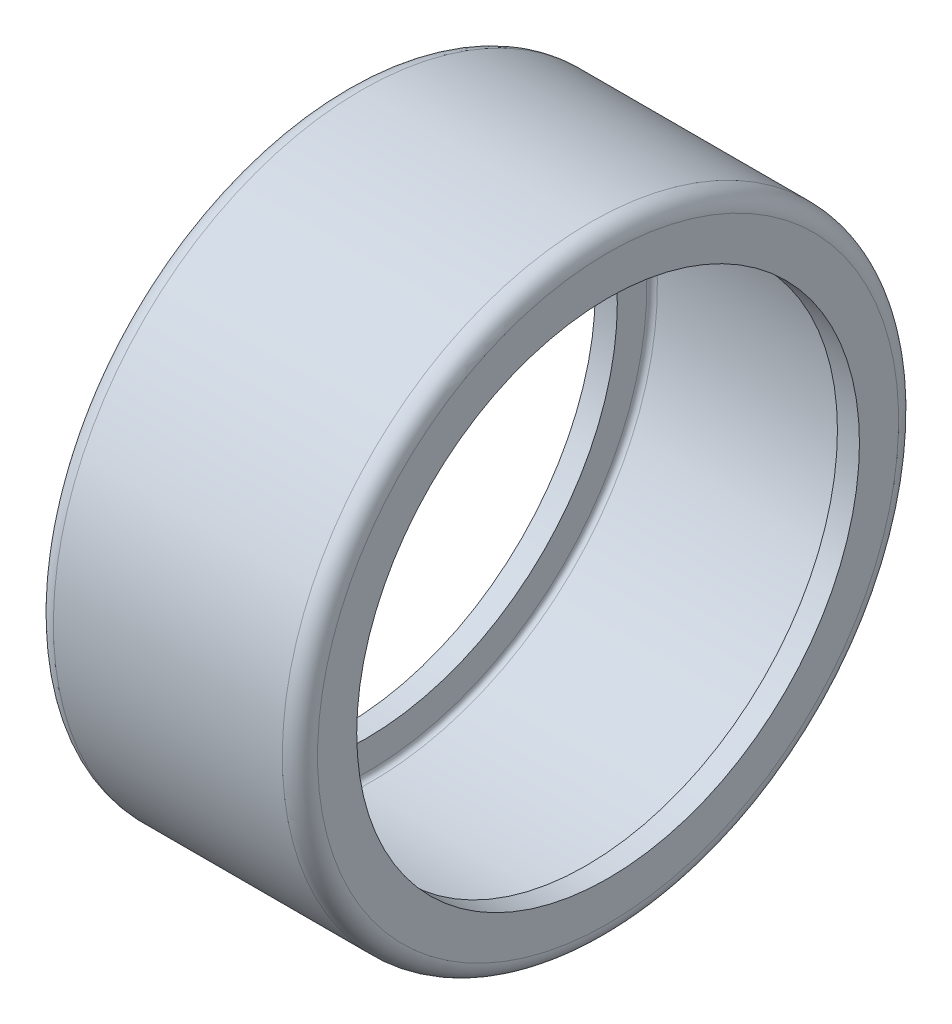
ISO-10303-21;
HEADER;
FILE_DESCRIPTION(('STEP AP214'),'2;1');
FILE_NAME('part.step','',(''),(''),'','','');
FILE_SCHEMA(('AUTOMOTIVE_DESIGN { 1 0 10303 214 1 1 1 1 }'));
ENDSEC;
DATA;
#1=APPLICATION_CONTEXT('core data for automotive mechanical design processes');
#2=APPLICATION_PROTOCOL_DEFINITION('international standard','automotive_design',2000,#1);
#3=PRODUCT_CONTEXT('',#1,'mechanical');
#4=PRODUCT('Part','Part','',(#3));
#5=PRODUCT_RELATED_PRODUCT_CATEGORY('part','',(#4));
#6=PRODUCT_DEFINITION_FORMATION('','',#4);
#7=PRODUCT_DEFINITION_CONTEXT('part definition',#1,'design');
#8=PRODUCT_DEFINITION('design','',#6,#7);
#9=PRODUCT_DEFINITION_SHAPE('','',#8);
#10=(LENGTH_UNIT() NAMED_UNIT(*) SI_UNIT(.MILLI.,.METRE.));
#11=(NAMED_UNIT(*) PLANE_ANGLE_UNIT() SI_UNIT($,.RADIAN.));
#12=(NAMED_UNIT(*) SI_UNIT($,.STERADIAN.) SOLID_ANGLE_UNIT());
#13=UNCERTAINTY_MEASURE_WITH_UNIT(LENGTH_MEASURE(1.E-05),#10,'distance_accuracy_value','');
#14=(GEOMETRIC_REPRESENTATION_CONTEXT(3) GLOBAL_UNCERTAINTY_ASSIGNED_CONTEXT((#13)) GLOBAL_UNIT_ASSIGNED_CONTEXT((#10,
#11,#12)) REPRESENTATION_CONTEXT('',''));
#15=CARTESIAN_POINT('',(0.,0.,0.));
#16=DIRECTION('',(0.,0.,1.));
#17=DIRECTION('',(1.,0.,0.));
#18=AXIS2_PLACEMENT_3D('',#15,#16,#17);
#19=CARTESIAN_POINT('',(11.5,0.,0.));
#20=DIRECTION('',(-1.,0.,0.));
#21=DIRECTION('',(0.,1.,0.));
#22=AXIS2_PLACEMENT_3D('',#19,#20,#21);
#23=CYLINDRICAL_SURFACE('',#22,11.42);
#24=CARTESIAN_POINT('',(12.,0.,0.));
#25=DIRECTION('',(1.,0.,0.));
#26=DIRECTION('',(0.,1.,0.));
#27=AXIS2_PLACEMENT_3D('',#24,#25,#26);
#28=CIRCLE('',#27,11.42);
#29=CARTESIAN_POINT('',(12.,11.42,0.));
#30=VERTEX_POINT('',#29);
#31=EDGE_CURVE('E10',#30,#30,#28,.T.);
#32=ORIENTED_EDGE('',*,*,#31,.T.);
#33=EDGE_LOOP('',(#32));
#34=FACE_BOUND('',#33,.T.);
#35=CARTESIAN_POINT('',(11.,0.,0.));
#36=DIRECTION('',(1.,0.,0.));
#37=DIRECTION('',(0.,1.,0.));
#38=AXIS2_PLACEMENT_3D('',#35,#36,#37);
#39=CIRCLE('',#38,11.42);
#40=CARTESIAN_POINT('',(11.,11.42,0.));
#41=VERTEX_POINT('',#40);
#42=EDGE_CURVE('E74',#41,#41,#39,.T.);
#43=ORIENTED_EDGE('',*,*,#42,.F.);
#44=EDGE_LOOP('',(#43));
#45=FACE_BOUND('',#44,.T.);
#46=ADVANCED_FACE('F16',(#34,#45),#23,.F.);
#47=CARTESIAN_POINT('',(12.,12.31,0.));
#48=DIRECTION('',(1.,0.,0.));
#49=DIRECTION('',(0.,1.,0.));
#50=AXIS2_PLACEMENT_3D('',#47,#48,#49);
#51=PLANE('',#50);
#52=CARTESIAN_POINT('',(12.,0.,0.));
#53=DIRECTION('',(1.,0.,0.));
#54=DIRECTION('',(0.,1.,0.));
#55=AXIS2_PLACEMENT_3D('',#52,#53,#54);
#56=CIRCLE('',#55,13.2);
#57=CARTESIAN_POINT('',(12.,13.2,0.));
#58=VERTEX_POINT('',#57);
#59=EDGE_CURVE('E26',#58,#58,#56,.T.);
#60=ORIENTED_EDGE('',*,*,#59,.T.);
#61=EDGE_LOOP('',(#60));
#62=FACE_BOUND('',#61,.T.);
#63=ORIENTED_EDGE('',*,*,#31,.F.);
#64=EDGE_LOOP('',(#63));
#65=FACE_BOUND('',#64,.T.);
#66=ADVANCED_FACE('F94',(#62,#65),#51,.T.);
#67=CARTESIAN_POINT('',(11.2,0.,0.));
#68=DIRECTION('',(1.,0.,0.));
#69=DIRECTION('',(0.,0.,-1.));
#70=AXIS2_PLACEMENT_3D('',#67,#68,#69);
#71=TOROIDAL_SURFACE('',#70,13.2,0.8);
#72=CARTESIAN_POINT('',(11.2,0.,0.));
#73=DIRECTION('',(1.,0.,0.));
#74=DIRECTION('',(0.,1.,0.));
#75=AXIS2_PLACEMENT_3D('',#72,#73,#74);
#76=CIRCLE('',#75,14.);
#77=CARTESIAN_POINT('',(11.2,14.,0.));
#78=VERTEX_POINT('',#77);
#79=EDGE_CURVE('E58',#78,#78,#76,.T.);
#80=ORIENTED_EDGE('',*,*,#79,.T.);
#81=EDGE_LOOP('',(#80));
#82=FACE_BOUND('',#81,.T.);
#83=ORIENTED_EDGE('',*,*,#59,.F.);
#84=EDGE_LOOP('',(#83));
#85=FACE_BOUND('',#84,.T.);
#86=ADVANCED_FACE('F59',(#82,#85),#71,.T.);
#87=CARTESIAN_POINT('',(6.,0.,0.));
#88=DIRECTION('',(-1.,0.,0.));
#89=DIRECTION('',(0.,1.,0.));
#90=AXIS2_PLACEMENT_3D('',#87,#88,#89);
#91=CYLINDRICAL_SURFACE('',#90,14.);
#92=CARTESIAN_POINT('',(0.8,0.,0.));
#93=DIRECTION('',(1.,0.,0.));
#94=DIRECTION('',(0.,1.,0.));
#95=AXIS2_PLACEMENT_3D('',#92,#93,#94);
#96=CIRCLE('',#95,14.);
#97=CARTESIAN_POINT('',(0.8,14.,0.));
#98=VERTEX_POINT('',#97);
#99=EDGE_CURVE('E62',#98,#98,#96,.T.);
#100=ORIENTED_EDGE('',*,*,#99,.T.);
#101=EDGE_LOOP('',(#100));
#102=FACE_BOUND('',#101,.T.);
#103=ORIENTED_EDGE('',*,*,#79,.F.);
#104=EDGE_LOOP('',(#103));
#105=FACE_BOUND('',#104,.T.);
#106=ADVANCED_FACE('F112',(#102,#105),#91,.T.);
#107=CARTESIAN_POINT('',(0.8,0.,0.));
#108=DIRECTION('',(1.,0.,0.));
#109=DIRECTION('',(0.,0.,-1.));
#110=AXIS2_PLACEMENT_3D('',#107,#108,#109);
#111=TOROIDAL_SURFACE('',#110,13.2,0.8);
#112=CARTESIAN_POINT('',(0.,0.,0.));
#113=DIRECTION('',(1.,0.,0.));
#114=DIRECTION('',(0.,1.,0.));
#115=AXIS2_PLACEMENT_3D('',#112,#113,#114);
#116=CIRCLE('',#115,13.2);
#117=CARTESIAN_POINT('',(0.,13.2,0.));
#118=VERTEX_POINT('',#117);
#119=EDGE_CURVE('E64',#118,#118,#116,.T.);
#120=ORIENTED_EDGE('',*,*,#119,.T.);
#121=EDGE_LOOP('',(#120));
#122=FACE_BOUND('',#121,.T.);
#123=ORIENTED_EDGE('',*,*,#99,.F.);
#124=EDGE_LOOP('',(#123));
#125=FACE_BOUND('',#124,.T.);
#126=ADVANCED_FACE('F114',(#122,#125),#111,.T.);
#127=CARTESIAN_POINT('',(0.,12.31,0.));
#128=DIRECTION('',(-1.,0.,0.));
#129=DIRECTION('',(0.,-1.,0.));
#130=AXIS2_PLACEMENT_3D('',#127,#128,#129);
#131=PLANE('',#130);
#132=CARTESIAN_POINT('',(0.,0.,0.));
#133=DIRECTION('',(1.,0.,0.));
#134=DIRECTION('',(0.,1.,0.));
#135=AXIS2_PLACEMENT_3D('',#132,#133,#134);
#136=CIRCLE('',#135,11.42);
#137=CARTESIAN_POINT('',(0.,11.42,0.));
#138=VERTEX_POINT('',#137);
#139=EDGE_CURVE('E134',#138,#138,#136,.T.);
#140=ORIENTED_EDGE('',*,*,#139,.T.);
#141=EDGE_LOOP('',(#140));
#142=FACE_BOUND('',#141,.T.);
#143=ORIENTED_EDGE('',*,*,#119,.F.);
#144=EDGE_LOOP('',(#143));
#145=FACE_BOUND('',#144,.T.);
#146=ADVANCED_FACE('F105',(#142,#145),#131,.T.);
#147=CARTESIAN_POINT('',(0.5,0.,0.));
#148=DIRECTION('',(-1.,0.,0.));
#149=DIRECTION('',(0.,1.,0.));
#150=AXIS2_PLACEMENT_3D('',#147,#148,#149);
#151=CYLINDRICAL_SURFACE('',#150,11.42);
#152=CARTESIAN_POINT('',(1.,0.,0.));
#153=DIRECTION('',(1.,0.,0.));
#154=DIRECTION('',(0.,1.,0.));
#155=AXIS2_PLACEMENT_3D('',#152,#153,#154);
#156=CIRCLE('',#155,11.42);
#157=CARTESIAN_POINT('',(1.,11.42,0.));
#158=VERTEX_POINT('',#157);
#159=EDGE_CURVE('E78',#158,#158,#156,.T.);
#160=ORIENTED_EDGE('',*,*,#159,.T.);
#161=EDGE_LOOP('',(#160));
#162=FACE_BOUND('',#161,.T.);
#163=ORIENTED_EDGE('',*,*,#139,.F.);
#164=EDGE_LOOP('',(#163));
#165=FACE_BOUND('',#164,.T.);
#166=ADVANCED_FACE('F102',(#162,#165),#151,.F.);
#167=CARTESIAN_POINT('',(1.,12.09,0.));
#168=DIRECTION('',(1.,0.,0.));
#169=DIRECTION('',(0.,1.,0.));
#170=AXIS2_PLACEMENT_3D('',#167,#168,#169);
#171=PLANE('',#170);
#172=CARTESIAN_POINT('',(1.,0.,0.));
#173=DIRECTION('',(1.,0.,0.));
#174=DIRECTION('',(0.,1.,0.));
#175=AXIS2_PLACEMENT_3D('',#172,#173,#174);
#176=CIRCLE('',#175,12.76);
#177=CARTESIAN_POINT('',(1.,12.76,0.));
#178=VERTEX_POINT('',#177);
#179=EDGE_CURVE('E71',#178,#178,#176,.T.);
#180=ORIENTED_EDGE('',*,*,#179,.T.);
#181=EDGE_LOOP('',(#180));
#182=FACE_BOUND('',#181,.T.);
#183=ORIENTED_EDGE('',*,*,#159,.F.);
#184=EDGE_LOOP('',(#183));
#185=FACE_BOUND('',#184,.T.);
#186=ADVANCED_FACE('F104',(#182,#185),#171,.T.);
#187=CARTESIAN_POINT('',(1.24,0.,0.));
#188=DIRECTION('',(1.,0.,0.));
#189=DIRECTION('',(0.,0.,-1.));
#190=AXIS2_PLACEMENT_3D('',#187,#188,#189);
#191=TOROIDAL_SURFACE('',#190,12.76,0.24);
#192=CARTESIAN_POINT('',(1.24,0.,0.));
#193=DIRECTION('',(1.,0.,0.));
#194=DIRECTION('',(0.,1.,0.));
#195=AXIS2_PLACEMENT_3D('',#192,#193,#194);
#196=CIRCLE('',#195,13.);
#197=CARTESIAN_POINT('',(1.24,13.,0.));
#198=VERTEX_POINT('',#197);
#199=EDGE_CURVE('E69',#198,#198,#196,.T.);
#200=ORIENTED_EDGE('',*,*,#199,.T.);
#201=EDGE_LOOP('',(#200));
#202=FACE_BOUND('',#201,.T.);
#203=ORIENTED_EDGE('',*,*,#179,.F.);
#204=EDGE_LOOP('',(#203));
#205=FACE_BOUND('',#204,.T.);
#206=ADVANCED_FACE('F110',(#202,#205),#191,.F.);
#207=CARTESIAN_POINT('',(6.,0.,0.));
#208=DIRECTION('',(-1.,0.,0.));
#209=DIRECTION('',(0.,1.,0.));
#210=AXIS2_PLACEMENT_3D('',#207,#208,#209);
#211=CYLINDRICAL_SURFACE('',#210,13.);
#212=CARTESIAN_POINT('',(10.76,0.,0.));
#213=DIRECTION('',(1.,0.,0.));
#214=DIRECTION('',(0.,1.,0.));
#215=AXIS2_PLACEMENT_3D('',#212,#213,#214);
#216=CIRCLE('',#215,13.);
#217=CARTESIAN_POINT('',(10.76,13.,0.));
#218=VERTEX_POINT('',#217);
#219=EDGE_CURVE('E72',#218,#218,#216,.T.);
#220=ORIENTED_EDGE('',*,*,#219,.T.);
#221=EDGE_LOOP('',(#220));
#222=FACE_BOUND('',#221,.T.);
#223=ORIENTED_EDGE('',*,*,#199,.F.);
#224=EDGE_LOOP('',(#223));
#225=FACE_BOUND('',#224,.T.);
#226=ADVANCED_FACE('F91',(#222,#225),#211,.F.);
#227=CARTESIAN_POINT('',(10.76,0.,0.));
#228=DIRECTION('',(1.,0.,0.));
#229=DIRECTION('',(0.,0.,-1.));
#230=AXIS2_PLACEMENT_3D('',#227,#228,#229);
#231=TOROIDAL_SURFACE('',#230,12.76,0.24);
#232=CARTESIAN_POINT('',(11.,0.,0.));
#233=DIRECTION('',(1.,0.,0.));
#234=DIRECTION('',(0.,1.,0.));
#235=AXIS2_PLACEMENT_3D('',#232,#233,#234);
#236=CIRCLE('',#235,12.76);
#237=CARTESIAN_POINT('',(11.,12.76,0.));
#238=VERTEX_POINT('',#237);
#239=EDGE_CURVE('E20',#238,#238,#236,.T.);
#240=ORIENTED_EDGE('',*,*,#239,.T.);
#241=EDGE_LOOP('',(#240));
#242=FACE_BOUND('',#241,.T.);
#243=ORIENTED_EDGE('',*,*,#219,.F.);
#244=EDGE_LOOP('',(#243));
#245=FACE_BOUND('',#244,.T.);
#246=ADVANCED_FACE('F83',(#242,#245),#231,.F.);
#247=CARTESIAN_POINT('',(11.,12.09,0.));
#248=DIRECTION('',(-1.,0.,0.));
#249=DIRECTION('',(0.,-1.,0.));
#250=AXIS2_PLACEMENT_3D('',#247,#248,#249);
#251=PLANE('',#250);
#252=ORIENTED_EDGE('',*,*,#42,.T.);
#253=EDGE_LOOP('',(#252));
#254=FACE_BOUND('',#253,.T.);
#255=ORIENTED_EDGE('',*,*,#239,.F.);
#256=EDGE_LOOP('',(#255));
#257=FACE_BOUND('',#256,.T.);
#258=ADVANCED_FACE('F18',(#254,#257),#251,.T.);
#259=CLOSED_SHELL('',(#46,#66,#86,#106,#126,#146,#166,#186,#206,#226,#246,#258));
#260=MANIFOLD_SOLID_BREP('B1',#259);
#261=ADVANCED_BREP_SHAPE_REPRESENTATION('',(#18,#260),#14);
#262=SHAPE_DEFINITION_REPRESENTATION(#9,#261);
ENDSEC;
END-ISO-10303-21;
